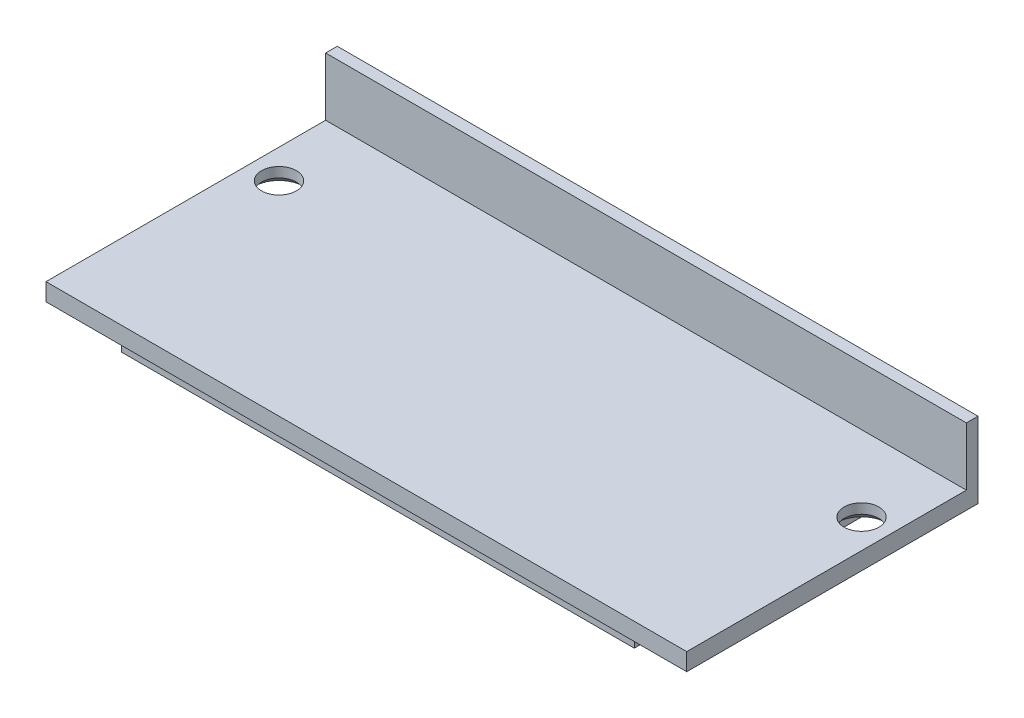
ISO-10303-21;
HEADER;
FILE_DESCRIPTION(('STEP AP214'),'2;1');
FILE_NAME('part.step','',(''),(''),'','','');
FILE_SCHEMA(('AUTOMOTIVE_DESIGN { 1 0 10303 214 1 1 1 1 }'));
ENDSEC;
DATA;
#1=APPLICATION_CONTEXT('core data for automotive mechanical design processes');
#2=APPLICATION_PROTOCOL_DEFINITION('international standard','automotive_design',2000,#1);
#3=PRODUCT_CONTEXT('',#1,'mechanical');
#4=PRODUCT('Part','Part','',(#3));
#5=PRODUCT_RELATED_PRODUCT_CATEGORY('part','',(#4));
#6=PRODUCT_DEFINITION_FORMATION('','',#4);
#7=PRODUCT_DEFINITION_CONTEXT('part definition',#1,'design');
#8=PRODUCT_DEFINITION('design','',#6,#7);
#9=PRODUCT_DEFINITION_SHAPE('','',#8);
#10=(LENGTH_UNIT() NAMED_UNIT(*) SI_UNIT(.MILLI.,.METRE.));
#11=(NAMED_UNIT(*) PLANE_ANGLE_UNIT() SI_UNIT($,.RADIAN.));
#12=(NAMED_UNIT(*) SI_UNIT($,.STERADIAN.) SOLID_ANGLE_UNIT());
#13=UNCERTAINTY_MEASURE_WITH_UNIT(LENGTH_MEASURE(1.E-05),#10,'distance_accuracy_value','');
#14=(GEOMETRIC_REPRESENTATION_CONTEXT(3) GLOBAL_UNCERTAINTY_ASSIGNED_CONTEXT((#13)) GLOBAL_UNIT_ASSIGNED_CONTEXT((#10,
#11,#12)) REPRESENTATION_CONTEXT('',''));
#15=CARTESIAN_POINT('',(0.,0.,0.));
#16=DIRECTION('',(0.,0.,1.));
#17=DIRECTION('',(1.,0.,0.));
#18=AXIS2_PLACEMENT_3D('',#15,#16,#17);
#19=CARTESIAN_POINT('',(-55.,1.5,50.));
#20=DIRECTION('',(0.,0.,1.));
#21=DIRECTION('',(1.,0.,0.));
#22=AXIS2_PLACEMENT_3D('',#19,#20,#21);
#23=PLANE('',#22);
#24=DIRECTION('',(0.,-1.,0.));
#25=VECTOR('',#24,1.);
#26=CARTESIAN_POINT('',(-55.,1.5,50.));
#27=LINE('',#26,#25);
#28=CARTESIAN_POINT('',(-55.,1.5,50.));
#29=VERTEX_POINT('',#28);
#30=CARTESIAN_POINT('',(-55.,-1.5,50.));
#31=VERTEX_POINT('',#30);
#32=EDGE_CURVE('E11',#29,#31,#27,.T.);
#33=ORIENTED_EDGE('',*,*,#32,.T.);
#34=DIRECTION('',(1.,0.,0.));
#35=VECTOR('',#34,1.);
#36=CARTESIAN_POINT('',(-55.,-1.5,50.));
#37=LINE('',#36,#35);
#38=CARTESIAN_POINT('',(55.,-1.5,50.));
#39=VERTEX_POINT('',#38);
#40=EDGE_CURVE('E27',#31,#39,#37,.T.);
#41=ORIENTED_EDGE('',*,*,#40,.T.);
#42=DIRECTION('',(0.,-1.,0.));
#43=VECTOR('',#42,1.);
#44=CARTESIAN_POINT('',(55.,1.5,50.));
#45=LINE('',#44,#43);
#46=CARTESIAN_POINT('',(55.,1.5,50.));
#47=VERTEX_POINT('',#46);
#48=EDGE_CURVE('E177',#47,#39,#45,.T.);
#49=ORIENTED_EDGE('',*,*,#48,.F.);
#50=DIRECTION('',(1.,0.,0.));
#51=VECTOR('',#50,1.);
#52=CARTESIAN_POINT('',(-55.,1.5,50.));
#53=LINE('',#52,#51);
#54=EDGE_CURVE('E172',#29,#47,#53,.T.);
#55=ORIENTED_EDGE('',*,*,#54,.F.);
#56=EDGE_LOOP('',(#33,#41,#49,#55));
#57=FACE_BOUND('',#56,.T.);
#58=ADVANCED_FACE('F17',(#57),#23,.T.);
#59=CARTESIAN_POINT('',(-55.,1.5,0.));
#60=DIRECTION('',(-1.,0.,0.));
#61=DIRECTION('',(0.,0.,1.));
#62=AXIS2_PLACEMENT_3D('',#59,#60,#61);
#63=PLANE('',#62);
#64=DIRECTION('',(0.,-1.,0.));
#65=VECTOR('',#64,1.);
#66=CARTESIAN_POINT('',(-55.,1.5,0.));
#67=LINE('',#66,#65);
#68=CARTESIAN_POINT('',(-55.,11.5,0.));
#69=VERTEX_POINT('',#68);
#70=CARTESIAN_POINT('',(-55.,-1.5,0.));
#71=VERTEX_POINT('',#70);
#72=EDGE_CURVE('E184',#69,#71,#67,.T.);
#73=ORIENTED_EDGE('',*,*,#72,.T.);
#74=DIRECTION('',(0.,0.,1.));
#75=VECTOR('',#74,1.);
#76=CARTESIAN_POINT('',(-55.,-1.5,0.));
#77=LINE('',#76,#75);
#78=EDGE_CURVE('E181',#71,#31,#77,.T.);
#79=ORIENTED_EDGE('',*,*,#78,.T.);
#80=ORIENTED_EDGE('',*,*,#32,.F.);
#81=DIRECTION('',(0.,0.,1.));
#82=VECTOR('',#81,1.);
#83=CARTESIAN_POINT('',(-55.,1.5,0.));
#84=LINE('',#83,#82);
#85=CARTESIAN_POINT('',(-55.,1.5,2.));
#86=VERTEX_POINT('',#85);
#87=EDGE_CURVE('E178',#86,#29,#84,.T.);
#88=ORIENTED_EDGE('',*,*,#87,.F.);
#89=DIRECTION('',(0.,1.,0.));
#90=VECTOR('',#89,1.);
#91=CARTESIAN_POINT('',(-55.,1.5,2.));
#92=LINE('',#91,#90);
#93=CARTESIAN_POINT('',(-55.,11.5,2.));
#94=VERTEX_POINT('',#93);
#95=EDGE_CURVE('E143',#86,#94,#92,.T.);
#96=ORIENTED_EDGE('',*,*,#95,.T.);
#97=DIRECTION('',(0.,0.,-1.));
#98=VECTOR('',#97,1.);
#99=CARTESIAN_POINT('',(-55.,11.5,2.));
#100=LINE('',#99,#98);
#101=EDGE_CURVE('E140',#94,#69,#100,.T.);
#102=ORIENTED_EDGE('',*,*,#101,.T.);
#103=EDGE_LOOP('',(#73,#79,#80,#88,#96,#102));
#104=FACE_BOUND('',#103,.T.);
#105=ADVANCED_FACE('F206',(#104),#63,.T.);
#106=CARTESIAN_POINT('',(55.,1.5,50.));
#107=DIRECTION('',(1.,0.,0.));
#108=DIRECTION('',(0.,0.,-1.));
#109=AXIS2_PLACEMENT_3D('',#106,#107,#108);
#110=PLANE('',#109);
#111=ORIENTED_EDGE('',*,*,#48,.T.);
#112=DIRECTION('',(0.,0.,-1.));
#113=VECTOR('',#112,1.);
#114=CARTESIAN_POINT('',(55.,-1.5,50.));
#115=LINE('',#114,#113);
#116=CARTESIAN_POINT('',(55.,-1.5,0.));
#117=VERTEX_POINT('',#116);
#118=EDGE_CURVE('E174',#39,#117,#115,.T.);
#119=ORIENTED_EDGE('',*,*,#118,.T.);
#120=DIRECTION('',(0.,-1.,0.));
#121=VECTOR('',#120,1.);
#122=CARTESIAN_POINT('',(55.,1.5,0.));
#123=LINE('',#122,#121);
#124=CARTESIAN_POINT('',(55.,11.5,0.));
#125=VERTEX_POINT('',#124);
#126=EDGE_CURVE('E149',#125,#117,#123,.T.);
#127=ORIENTED_EDGE('',*,*,#126,.F.);
#128=DIRECTION('',(0.,0.,1.));
#129=VECTOR('',#128,1.);
#130=CARTESIAN_POINT('',(55.,11.5,0.));
#131=LINE('',#130,#129);
#132=CARTESIAN_POINT('',(55.,11.5,2.));
#133=VERTEX_POINT('',#132);
#134=EDGE_CURVE('E137',#125,#133,#131,.T.);
#135=ORIENTED_EDGE('',*,*,#134,.T.);
#136=DIRECTION('',(0.,1.,0.));
#137=VECTOR('',#136,1.);
#138=CARTESIAN_POINT('',(55.,1.5,2.));
#139=LINE('',#138,#137);
#140=CARTESIAN_POINT('',(55.,1.5,2.));
#141=VERTEX_POINT('',#140);
#142=EDGE_CURVE('E135',#141,#133,#139,.T.);
#143=ORIENTED_EDGE('',*,*,#142,.F.);
#144=DIRECTION('',(0.,0.,-1.));
#145=VECTOR('',#144,1.);
#146=CARTESIAN_POINT('',(55.,1.5,50.));
#147=LINE('',#146,#145);
#148=EDGE_CURVE('E169',#47,#141,#147,.T.);
#149=ORIENTED_EDGE('',*,*,#148,.F.);
#150=EDGE_LOOP('',(#111,#119,#127,#135,#143,#149));
#151=FACE_BOUND('',#150,.T.);
#152=ADVANCED_FACE('F198',(#151),#110,.T.);
#153=CARTESIAN_POINT('',(0.,1.5,25.));
#154=DIRECTION('',(0.,1.,0.));
#155=DIRECTION('',(0.,0.,1.));
#156=AXIS2_PLACEMENT_3D('',#153,#154,#155);
#157=PLANE('',#156);
#158=ORIENTED_EDGE('',*,*,#87,.T.);
#159=ORIENTED_EDGE('',*,*,#54,.T.);
#160=ORIENTED_EDGE('',*,*,#148,.T.);
#161=DIRECTION('',(-1.,0.,0.));
#162=VECTOR('',#161,1.);
#163=CARTESIAN_POINT('',(55.,1.5,2.));
#164=LINE('',#163,#162);
#165=EDGE_CURVE('E156',#141,#86,#164,.T.);
#166=ORIENTED_EDGE('',*,*,#165,.T.);
#167=EDGE_LOOP('',(#158,#159,#160,#166));
#168=FACE_BOUND('',#167,.T.);
#169=CARTESIAN_POINT('',(-50.,1.5,15.));
#170=DIRECTION('',(0.,1.,0.));
#171=DIRECTION('',(1.,0.,0.));
#172=AXIS2_PLACEMENT_3D('',#169,#170,#171);
#173=CIRCLE('',#172,3.);
#174=CARTESIAN_POINT('',(-47.,1.5,15.));
#175=VERTEX_POINT('',#174);
#176=EDGE_CURVE('E127',#175,#175,#173,.T.);
#177=ORIENTED_EDGE('',*,*,#176,.F.);
#178=EDGE_LOOP('',(#177));
#179=FACE_BOUND('',#178,.T.);
#180=CARTESIAN_POINT('',(50.,1.5,15.));
#181=DIRECTION('',(0.,1.,0.));
#182=DIRECTION('',(1.,0.,0.));
#183=AXIS2_PLACEMENT_3D('',#180,#181,#182);
#184=CIRCLE('',#183,3.);
#185=CARTESIAN_POINT('',(53.,1.5,15.));
#186=VERTEX_POINT('',#185);
#187=EDGE_CURVE('E128',#186,#186,#184,.T.);
#188=ORIENTED_EDGE('',*,*,#187,.F.);
#189=EDGE_LOOP('',(#188));
#190=FACE_BOUND('',#189,.T.);
#191=ADVANCED_FACE('F202',(#168,#179,#190),#157,.T.);
#192=CARTESIAN_POINT('',(0.,-1.5,25.));
#193=DIRECTION('',(0.,1.,0.));
#194=DIRECTION('',(0.,0.,1.));
#195=AXIS2_PLACEMENT_3D('',#192,#193,#194);
#196=PLANE('',#195);
#197=ORIENTED_EDGE('',*,*,#78,.F.);
#198=DIRECTION('',(-1.,0.,0.));
#199=VECTOR('',#198,1.);
#200=CARTESIAN_POINT('',(55.,-1.5,0.));
#201=LINE('',#200,#199);
#202=EDGE_CURVE('E146',#117,#71,#201,.T.);
#203=ORIENTED_EDGE('',*,*,#202,.F.);
#204=ORIENTED_EDGE('',*,*,#118,.F.);
#205=ORIENTED_EDGE('',*,*,#40,.F.);
#206=EDGE_LOOP('',(#197,#203,#204,#205));
#207=FACE_BOUND('',#206,.T.);
#208=CARTESIAN_POINT('',(-50.,-1.5,15.));
#209=DIRECTION('',(0.,-1.,0.));
#210=DIRECTION('',(1.,0.,0.));
#211=AXIS2_PLACEMENT_3D('',#208,#209,#210);
#212=CIRCLE('',#211,4.3);
#213=CARTESIAN_POINT('',(-45.7,-1.5,15.));
#214=VERTEX_POINT('',#213);
#215=EDGE_CURVE('E159',#214,#214,#212,.T.);
#216=ORIENTED_EDGE('',*,*,#215,.F.);
#217=EDGE_LOOP('',(#216));
#218=FACE_BOUND('',#217,.T.);
#219=CARTESIAN_POINT('',(50.,-1.5,15.));
#220=DIRECTION('',(0.,-1.,0.));
#221=DIRECTION('',(1.,0.,0.));
#222=AXIS2_PLACEMENT_3D('',#219,#220,#221);
#223=CIRCLE('',#222,4.3);
#224=CARTESIAN_POINT('',(54.3,-1.5,15.));
#225=VERTEX_POINT('',#224);
#226=EDGE_CURVE('E123',#225,#225,#223,.T.);
#227=ORIENTED_EDGE('',*,*,#226,.F.);
#228=EDGE_LOOP('',(#227));
#229=FACE_BOUND('',#228,.T.);
#230=DIRECTION('',(0.,0.,-1.));
#231=VECTOR('',#230,1.);
#232=CARTESIAN_POINT('',(44.,-1.5,48.));
#233=LINE('',#232,#231);
#234=CARTESIAN_POINT('',(44.,-1.5,48.));
#235=VERTEX_POINT('',#234);
#236=CARTESIAN_POINT('',(44.,-1.5,2.));
#237=VERTEX_POINT('',#236);
#238=EDGE_CURVE('E153',#235,#237,#233,.T.);
#239=ORIENTED_EDGE('',*,*,#238,.T.);
#240=DIRECTION('',(-1.,0.,0.));
#241=VECTOR('',#240,1.);
#242=CARTESIAN_POINT('',(44.,-1.5,2.));
#243=LINE('',#242,#241);
#244=CARTESIAN_POINT('',(-44.,-1.5,2.));
#245=VERTEX_POINT('',#244);
#246=EDGE_CURVE('E151',#237,#245,#243,.T.);
#247=ORIENTED_EDGE('',*,*,#246,.T.);
#248=DIRECTION('',(0.,0.,1.));
#249=VECTOR('',#248,1.);
#250=CARTESIAN_POINT('',(-44.,-1.5,2.));
#251=LINE('',#250,#249);
#252=CARTESIAN_POINT('',(-44.,-1.5,48.));
#253=VERTEX_POINT('',#252);
#254=EDGE_CURVE('E101',#245,#253,#251,.T.);
#255=ORIENTED_EDGE('',*,*,#254,.T.);
#256=DIRECTION('',(1.,0.,0.));
#257=VECTOR('',#256,1.);
#258=CARTESIAN_POINT('',(-44.,-1.5,48.));
#259=LINE('',#258,#257);
#260=EDGE_CURVE('E147',#253,#235,#259,.T.);
#261=ORIENTED_EDGE('',*,*,#260,.T.);
#262=EDGE_LOOP('',(#239,#247,#255,#261));
#263=FACE_BOUND('',#262,.T.);
#264=ADVANCED_FACE('F195',(#207,#218,#229,#263),#196,.F.);
#265=CARTESIAN_POINT('',(55.,1.5,0.));
#266=DIRECTION('',(0.,0.,-1.));
#267=DIRECTION('',(-1.,0.,0.));
#268=AXIS2_PLACEMENT_3D('',#265,#266,#267);
#269=PLANE('',#268);
#270=ORIENTED_EDGE('',*,*,#126,.T.);
#271=ORIENTED_EDGE('',*,*,#202,.T.);
#272=ORIENTED_EDGE('',*,*,#72,.F.);
#273=DIRECTION('',(1.,0.,0.));
#274=VECTOR('',#273,1.);
#275=CARTESIAN_POINT('',(-55.,11.5,0.));
#276=LINE('',#275,#274);
#277=EDGE_CURVE('E21',#69,#125,#276,.T.);
#278=ORIENTED_EDGE('',*,*,#277,.T.);
#279=EDGE_LOOP('',(#270,#271,#272,#278));
#280=FACE_BOUND('',#279,.T.);
#281=ADVANCED_FACE('F210',(#280),#269,.T.);
#282=CARTESIAN_POINT('',(55.,1.5,2.));
#283=DIRECTION('',(0.,0.,1.));
#284=DIRECTION('',(-1.,0.,0.));
#285=AXIS2_PLACEMENT_3D('',#282,#283,#284);
#286=PLANE('',#285);
#287=ORIENTED_EDGE('',*,*,#142,.T.);
#288=DIRECTION('',(-1.,0.,0.));
#289=VECTOR('',#288,1.);
#290=CARTESIAN_POINT('',(55.,11.5,2.));
#291=LINE('',#290,#289);
#292=EDGE_CURVE('E132',#133,#94,#291,.T.);
#293=ORIENTED_EDGE('',*,*,#292,.T.);
#294=ORIENTED_EDGE('',*,*,#95,.F.);
#295=ORIENTED_EDGE('',*,*,#165,.F.);
#296=EDGE_LOOP('',(#287,#293,#294,#295));
#297=FACE_BOUND('',#296,.T.);
#298=ADVANCED_FACE('F215',(#297),#286,.T.);
#299=CARTESIAN_POINT('',(-50.,-0.2,15.));
#300=DIRECTION('',(0.,1.,0.));
#301=DIRECTION('',(1.,0.,0.));
#302=AXIS2_PLACEMENT_3D('',#299,#300,#301);
#303=CYLINDRICAL_SURFACE('',#302,3.);
#304=ORIENTED_EDGE('',*,*,#176,.T.);
#305=EDGE_LOOP('',(#304));
#306=FACE_BOUND('',#305,.T.);
#307=CARTESIAN_POINT('',(-50.,-0.2,15.));
#308=DIRECTION('',(0.,-1.,0.));
#309=DIRECTION('',(1.,0.,0.));
#310=AXIS2_PLACEMENT_3D('',#307,#308,#309);
#311=CIRCLE('',#310,3.);
#312=CARTESIAN_POINT('',(-47.,-0.2,15.));
#313=VERTEX_POINT('',#312);
#314=EDGE_CURVE('E129',#313,#313,#311,.T.);
#315=ORIENTED_EDGE('',*,*,#314,.T.);
#316=EDGE_LOOP('',(#315));
#317=FACE_BOUND('',#316,.T.);
#318=ADVANCED_FACE('F217',(#306,#317),#303,.F.);
#319=CARTESIAN_POINT('',(50.,-0.2,15.));
#320=DIRECTION('',(0.,1.,0.));
#321=DIRECTION('',(1.,0.,0.));
#322=AXIS2_PLACEMENT_3D('',#319,#320,#321);
#323=CYLINDRICAL_SURFACE('',#322,3.);
#324=ORIENTED_EDGE('',*,*,#187,.T.);
#325=EDGE_LOOP('',(#324));
#326=FACE_BOUND('',#325,.T.);
#327=CARTESIAN_POINT('',(50.,-0.2,15.));
#328=DIRECTION('',(0.,-1.,0.));
#329=DIRECTION('',(1.,0.,0.));
#330=AXIS2_PLACEMENT_3D('',#327,#328,#329);
#331=CIRCLE('',#330,3.);
#332=CARTESIAN_POINT('',(53.,-0.2,15.));
#333=VERTEX_POINT('',#332);
#334=EDGE_CURVE('E124',#333,#333,#331,.T.);
#335=ORIENTED_EDGE('',*,*,#334,.T.);
#336=EDGE_LOOP('',(#335));
#337=FACE_BOUND('',#336,.T.);
#338=ADVANCED_FACE('F224',(#326,#337),#323,.F.);
#339=CARTESIAN_POINT('',(-50.,-1.5,15.));
#340=DIRECTION('',(0.,-1.,0.));
#341=DIRECTION('',(1.,0.,0.));
#342=AXIS2_PLACEMENT_3D('',#339,#340,#341);
#343=CONICAL_SURFACE('',#342,4.3,0.785398163397);
#344=ORIENTED_EDGE('',*,*,#314,.F.);
#345=EDGE_LOOP('',(#344));
#346=FACE_BOUND('',#345,.T.);
#347=ORIENTED_EDGE('',*,*,#215,.T.);
#348=EDGE_LOOP('',(#347));
#349=FACE_BOUND('',#348,.T.);
#350=ADVANCED_FACE('F272',(#346,#349),#343,.F.);
#351=CARTESIAN_POINT('',(50.,-1.5,15.));
#352=DIRECTION('',(0.,-1.,0.));
#353=DIRECTION('',(1.,0.,0.));
#354=AXIS2_PLACEMENT_3D('',#351,#352,#353);
#355=CONICAL_SURFACE('',#354,4.3,0.785398163397);
#356=ORIENTED_EDGE('',*,*,#334,.F.);
#357=EDGE_LOOP('',(#356));
#358=FACE_BOUND('',#357,.T.);
#359=ORIENTED_EDGE('',*,*,#226,.T.);
#360=EDGE_LOOP('',(#359));
#361=FACE_BOUND('',#360,.T.);
#362=ADVANCED_FACE('F282',(#358,#361),#355,.F.);
#363=CARTESIAN_POINT('',(-44.,-1.5,48.));
#364=DIRECTION('',(0.,0.,1.));
#365=DIRECTION('',(1.,0.,0.));
#366=AXIS2_PLACEMENT_3D('',#363,#364,#365);
#367=PLANE('',#366);
#368=DIRECTION('',(0.,-1.,0.));
#369=VECTOR('',#368,1.);
#370=CARTESIAN_POINT('',(-44.,-1.5,48.));
#371=LINE('',#370,#369);
#372=CARTESIAN_POINT('',(-44.,-4.5,48.));
#373=VERTEX_POINT('',#372);
#374=EDGE_CURVE('E121',#253,#373,#371,.T.);
#375=ORIENTED_EDGE('',*,*,#374,.T.);
#376=DIRECTION('',(1.,0.,0.));
#377=VECTOR('',#376,1.);
#378=CARTESIAN_POINT('',(-44.,-4.5,48.));
#379=LINE('',#378,#377);
#380=CARTESIAN_POINT('',(44.,-4.5,48.));
#381=VERTEX_POINT('',#380);
#382=EDGE_CURVE('E111',#373,#381,#379,.T.);
#383=ORIENTED_EDGE('',*,*,#382,.T.);
#384=DIRECTION('',(0.,-1.,0.));
#385=VECTOR('',#384,1.);
#386=CARTESIAN_POINT('',(44.,-1.5,48.));
#387=LINE('',#386,#385);
#388=EDGE_CURVE('E118',#235,#381,#387,.T.);
#389=ORIENTED_EDGE('',*,*,#388,.F.);
#390=ORIENTED_EDGE('',*,*,#260,.F.);
#391=EDGE_LOOP('',(#375,#383,#389,#390));
#392=FACE_BOUND('',#391,.T.);
#393=ADVANCED_FACE('F292',(#392),#367,.T.);
#394=CARTESIAN_POINT('',(44.,-1.5,48.));
#395=DIRECTION('',(1.,0.,0.));
#396=DIRECTION('',(0.,0.,-1.));
#397=AXIS2_PLACEMENT_3D('',#394,#395,#396);
#398=PLANE('',#397);
#399=ORIENTED_EDGE('',*,*,#388,.T.);
#400=DIRECTION('',(0.,0.,-1.));
#401=VECTOR('',#400,1.);
#402=CARTESIAN_POINT('',(44.,-4.5,48.));
#403=LINE('',#402,#401);
#404=CARTESIAN_POINT('',(44.,-4.5,2.));
#405=VERTEX_POINT('',#404);
#406=EDGE_CURVE('E116',#381,#405,#403,.T.);
#407=ORIENTED_EDGE('',*,*,#406,.T.);
#408=DIRECTION('',(0.,-1.,0.));
#409=VECTOR('',#408,1.);
#410=CARTESIAN_POINT('',(44.,-1.5,2.));
#411=LINE('',#410,#409);
#412=EDGE_CURVE('E89',#237,#405,#411,.T.);
#413=ORIENTED_EDGE('',*,*,#412,.F.);
#414=ORIENTED_EDGE('',*,*,#238,.F.);
#415=EDGE_LOOP('',(#399,#407,#413,#414));
#416=FACE_BOUND('',#415,.T.);
#417=ADVANCED_FACE('F302',(#416),#398,.T.);
#418=CARTESIAN_POINT('',(44.,-1.5,2.));
#419=DIRECTION('',(0.,0.,-1.));
#420=DIRECTION('',(-1.,0.,0.));
#421=AXIS2_PLACEMENT_3D('',#418,#419,#420);
#422=PLANE('',#421);
#423=ORIENTED_EDGE('',*,*,#412,.T.);
#424=DIRECTION('',(-1.,0.,0.));
#425=VECTOR('',#424,1.);
#426=CARTESIAN_POINT('',(44.,-4.5,2.));
#427=LINE('',#426,#425);
#428=CARTESIAN_POINT('',(-44.,-4.5,2.));
#429=VERTEX_POINT('',#428);
#430=EDGE_CURVE('E103',#405,#429,#427,.T.);
#431=ORIENTED_EDGE('',*,*,#430,.T.);
#432=DIRECTION('',(0.,-1.,0.));
#433=VECTOR('',#432,1.);
#434=CARTESIAN_POINT('',(-44.,-1.5,2.));
#435=LINE('',#434,#433);
#436=EDGE_CURVE('E95',#245,#429,#435,.T.);
#437=ORIENTED_EDGE('',*,*,#436,.F.);
#438=ORIENTED_EDGE('',*,*,#246,.F.);
#439=EDGE_LOOP('',(#423,#431,#437,#438));
#440=FACE_BOUND('',#439,.T.);
#441=ADVANCED_FACE('F106',(#440),#422,.T.);
#442=CARTESIAN_POINT('',(-44.,-1.5,2.));
#443=DIRECTION('',(-1.,0.,0.));
#444=DIRECTION('',(0.,0.,1.));
#445=AXIS2_PLACEMENT_3D('',#442,#443,#444);
#446=PLANE('',#445);
#447=ORIENTED_EDGE('',*,*,#436,.T.);
#448=DIRECTION('',(0.,0.,1.));
#449=VECTOR('',#448,1.);
#450=CARTESIAN_POINT('',(-44.,-4.5,2.));
#451=LINE('',#450,#449);
#452=EDGE_CURVE('E99',#429,#373,#451,.T.);
#453=ORIENTED_EDGE('',*,*,#452,.T.);
#454=ORIENTED_EDGE('',*,*,#374,.F.);
#455=ORIENTED_EDGE('',*,*,#254,.F.);
#456=EDGE_LOOP('',(#447,#453,#454,#455));
#457=FACE_BOUND('',#456,.T.);
#458=ADVANCED_FACE('F96',(#457),#446,.T.);
#459=CARTESIAN_POINT('',(0.,11.5,1.));
#460=DIRECTION('',(0.,-1.,0.));
#461=DIRECTION('',(0.,0.,-1.));
#462=AXIS2_PLACEMENT_3D('',#459,#460,#461);
#463=PLANE('',#462);
#464=ORIENTED_EDGE('',*,*,#101,.F.);
#465=ORIENTED_EDGE('',*,*,#292,.F.);
#466=ORIENTED_EDGE('',*,*,#134,.F.);
#467=ORIENTED_EDGE('',*,*,#277,.F.);
#468=EDGE_LOOP('',(#464,#465,#466,#467));
#469=FACE_BOUND('',#468,.T.);
#470=ADVANCED_FACE('F212',(#469),#463,.F.);
#471=CARTESIAN_POINT('',(0.,-4.5,25.));
#472=DIRECTION('',(0.,1.,0.));
#473=DIRECTION('',(0.,0.,1.));
#474=AXIS2_PLACEMENT_3D('',#471,#472,#473);
#475=PLANE('',#474);
#476=ORIENTED_EDGE('',*,*,#452,.F.);
#477=ORIENTED_EDGE('',*,*,#430,.F.);
#478=ORIENTED_EDGE('',*,*,#406,.F.);
#479=ORIENTED_EDGE('',*,*,#382,.F.);
#480=EDGE_LOOP('',(#476,#477,#478,#479));
#481=FACE_BOUND('',#480,.T.);
#482=ADVANCED_FACE('F19',(#481),#475,.F.);
#483=CLOSED_SHELL('',(#58,#105,#152,#191,#264,#281,#298,#318,#338,#350,#362,#393,#417,#441,#458,
#470,#482));
#484=MANIFOLD_SOLID_BREP('B1',#483);
#485=ADVANCED_BREP_SHAPE_REPRESENTATION('',(#18,#484),#14);
#486=SHAPE_DEFINITION_REPRESENTATION(#9,#485);
ENDSEC;
END-ISO-10303-21;
